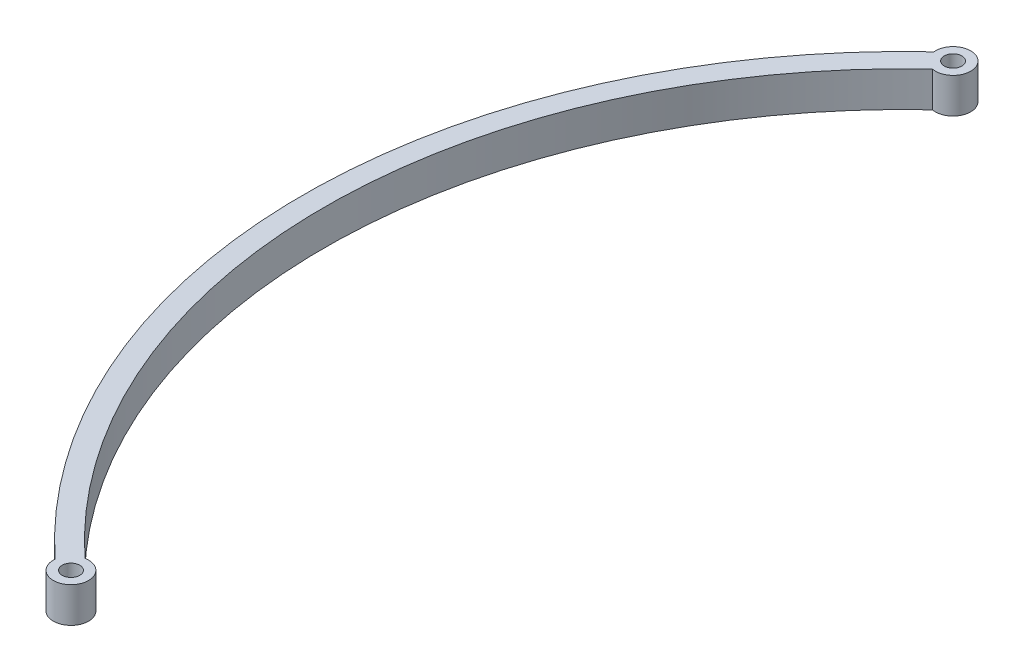
ISO-10303-21;
HEADER;
FILE_DESCRIPTION(('STEP AP214'),'2;1');
FILE_NAME('part.step','',(''),(''),'','','');
FILE_SCHEMA(('AUTOMOTIVE_DESIGN { 1 0 10303 214 1 1 1 1 }'));
ENDSEC;
DATA;
#1=APPLICATION_CONTEXT('core data for automotive mechanical design processes');
#2=APPLICATION_PROTOCOL_DEFINITION('international standard','automotive_design',2000,#1);
#3=PRODUCT_CONTEXT('',#1,'mechanical');
#4=PRODUCT('Part','Part','',(#3));
#5=PRODUCT_RELATED_PRODUCT_CATEGORY('part','',(#4));
#6=PRODUCT_DEFINITION_FORMATION('','',#4);
#7=PRODUCT_DEFINITION_CONTEXT('part definition',#1,'design');
#8=PRODUCT_DEFINITION('design','',#6,#7);
#9=PRODUCT_DEFINITION_SHAPE('','',#8);
#10=(LENGTH_UNIT() NAMED_UNIT(*) SI_UNIT(.MILLI.,.METRE.));
#11=(NAMED_UNIT(*) PLANE_ANGLE_UNIT() SI_UNIT($,.RADIAN.));
#12=(NAMED_UNIT(*) SI_UNIT($,.STERADIAN.) SOLID_ANGLE_UNIT());
#13=UNCERTAINTY_MEASURE_WITH_UNIT(LENGTH_MEASURE(1.E-05),#10,'distance_accuracy_value','');
#14=(GEOMETRIC_REPRESENTATION_CONTEXT(3) GLOBAL_UNCERTAINTY_ASSIGNED_CONTEXT((#13)) GLOBAL_UNIT_ASSIGNED_CONTEXT((#10,
#11,#12)) REPRESENTATION_CONTEXT('',''));
#15=CARTESIAN_POINT('',(0.,0.,0.));
#16=DIRECTION('',(0.,0.,1.));
#17=DIRECTION('',(1.,0.,0.));
#18=AXIS2_PLACEMENT_3D('',#15,#16,#17);
#19=CARTESIAN_POINT('',(110.830809160293,10.,-93.6090738604403));
#20=DIRECTION('',(0.,-1.,0.));
#21=DIRECTION('',(0.,0.,-1.));
#22=AXIS2_PLACEMENT_3D('',#19,#20,#21);
#23=CYLINDRICAL_SURFACE('',#22,170.058278032354);
#24=CARTESIAN_POINT('',(110.830809160293,0.,-93.6090738604403));
#25=DIRECTION('',(0.,1.,0.));
#26=DIRECTION('',(0.,0.,1.));
#27=AXIS2_PLACEMENT_3D('',#24,#25,#26);
#28=CIRCLE('',#27,170.058278032354);
#29=CARTESIAN_POINT('',(-4.97801718630081,0.,-218.140731151084));
#30=VERTEX_POINT('',#29);
#31=CARTESIAN_POINT('',(-4.97801718624232,0.,30.9225834302554));
#32=VERTEX_POINT('',#31);
#33=EDGE_CURVE('E95',#30,#32,#28,.T.);
#34=ORIENTED_EDGE('',*,*,#33,.T.);
#35=DIRECTION('',(0.,-1.,0.));
#36=VECTOR('',#35,1.);
#37=CARTESIAN_POINT('',(-4.97801718624232,10.,30.9225834302554));
#38=LINE('',#37,#36);
#39=CARTESIAN_POINT('',(-4.97801718624232,10.,30.9225834302554));
#40=VERTEX_POINT('',#39);
#41=EDGE_CURVE('E11',#40,#32,#38,.T.);
#42=ORIENTED_EDGE('',*,*,#41,.F.);
#43=CARTESIAN_POINT('',(110.830809160293,10.,-93.6090738604403));
#44=DIRECTION('',(0.,1.,0.));
#45=DIRECTION('',(0.,0.,1.));
#46=AXIS2_PLACEMENT_3D('',#43,#44,#45);
#47=CIRCLE('',#46,170.058278032354);
#48=CARTESIAN_POINT('',(-4.97801718630081,10.,-218.140731151084));
#49=VERTEX_POINT('',#48);
#50=EDGE_CURVE('E83',#49,#40,#47,.T.);
#51=ORIENTED_EDGE('',*,*,#50,.F.);
#52=DIRECTION('',(0.,-1.,0.));
#53=VECTOR('',#52,1.);
#54=CARTESIAN_POINT('',(-4.97801718630081,10.,-218.140731151084));
#55=LINE('',#54,#53);
#56=EDGE_CURVE('E91',#49,#30,#55,.T.);
#57=ORIENTED_EDGE('',*,*,#56,.T.);
#58=EDGE_LOOP('',(#34,#42,#51,#57));
#59=FACE_BOUND('',#58,.T.);
#60=ADVANCED_FACE('F32',(#59),#23,.T.);
#61=CARTESIAN_POINT('',(3.82679998800484E-12,10.,31.3909261396098));
#62=DIRECTION('',(0.,-1.,0.));
#63=DIRECTION('',(0.,0.,-1.));
#64=AXIS2_PLACEMENT_3D('',#61,#62,#63);
#65=CYLINDRICAL_SURFACE('',#64,4.99999999999675);
#66=CARTESIAN_POINT('',(3.82679998800484E-12,0.,31.3909261396098));
#67=DIRECTION('',(0.,1.,0.));
#68=DIRECTION('',(0.,0.,1.));
#69=AXIS2_PLACEMENT_3D('',#66,#67,#68);
#70=CIRCLE('',#69,4.99999999999675);
#71=CARTESIAN_POINT('',(-0.943707895465828,0.,26.4807921895021));
#72=VERTEX_POINT('',#71);
#73=EDGE_CURVE('E87',#32,#72,#70,.T.);
#74=ORIENTED_EDGE('',*,*,#73,.T.);
#75=DIRECTION('',(0.,-1.,0.));
#76=VECTOR('',#75,1.);
#77=CARTESIAN_POINT('',(-0.943707895465828,10.,26.4807921895021));
#78=LINE('',#77,#76);
#79=CARTESIAN_POINT('',(-0.943707895465828,10.,26.4807921895021));
#80=VERTEX_POINT('',#79);
#81=EDGE_CURVE('E40',#80,#72,#78,.T.);
#82=ORIENTED_EDGE('',*,*,#81,.F.);
#83=CARTESIAN_POINT('',(3.82679998800484E-12,10.,31.3909261396098));
#84=DIRECTION('',(0.,1.,0.));
#85=DIRECTION('',(0.,0.,1.));
#86=AXIS2_PLACEMENT_3D('',#83,#84,#85);
#87=CIRCLE('',#86,4.99999999999675);
#88=EDGE_CURVE('E78',#40,#80,#87,.T.);
#89=ORIENTED_EDGE('',*,*,#88,.F.);
#90=ORIENTED_EDGE('',*,*,#41,.T.);
#91=EDGE_LOOP('',(#74,#82,#89,#90));
#92=FACE_BOUND('',#91,.T.);
#93=ADVANCED_FACE('F86',(#92),#65,.T.);
#94=CARTESIAN_POINT('',(110.830809160322,10.,-93.6090738604163));
#95=DIRECTION('',(0.,-1.,0.));
#96=DIRECTION('',(0.,0.,-1.));
#97=AXIS2_PLACEMENT_3D('',#94,#95,#96);
#98=CYLINDRICAL_SURFACE('',#97,164.058278032357);
#99=CARTESIAN_POINT('',(110.830809160322,0.,-93.6090738604163));
#100=DIRECTION('',(0.,-1.,0.));
#101=DIRECTION('',(0.,0.,1.));
#102=AXIS2_PLACEMENT_3D('',#99,#100,#101);
#103=CIRCLE('',#102,164.058278032357);
#104=CARTESIAN_POINT('',(-0.943707895522329,0.,-213.698939910281));
#105=VERTEX_POINT('',#104);
#106=EDGE_CURVE('E65',#72,#105,#103,.T.);
#107=ORIENTED_EDGE('',*,*,#106,.T.);
#108=DIRECTION('',(0.,-1.,0.));
#109=VECTOR('',#108,1.);
#110=CARTESIAN_POINT('',(-0.943707895522329,10.,-213.698939910281));
#111=LINE('',#110,#109);
#112=CARTESIAN_POINT('',(-0.943707895522329,10.,-213.698939910281));
#113=VERTEX_POINT('',#112);
#114=EDGE_CURVE('E88',#113,#105,#111,.T.);
#115=ORIENTED_EDGE('',*,*,#114,.F.);
#116=CARTESIAN_POINT('',(110.830809160322,10.,-93.6090738604163));
#117=DIRECTION('',(0.,-1.,0.));
#118=DIRECTION('',(0.,0.,1.));
#119=AXIS2_PLACEMENT_3D('',#116,#117,#118);
#120=CIRCLE('',#119,164.058278032357);
#121=EDGE_CURVE('E81',#80,#113,#120,.T.);
#122=ORIENTED_EDGE('',*,*,#121,.F.);
#123=ORIENTED_EDGE('',*,*,#81,.T.);
#124=EDGE_LOOP('',(#107,#115,#122,#123));
#125=FACE_BOUND('',#124,.T.);
#126=ADVANCED_FACE('F89',(#125),#98,.F.);
#127=CARTESIAN_POINT('',(-4.68453401070157E-11,10.,-218.60907386039));
#128=DIRECTION('',(0.,-1.,0.));
#129=DIRECTION('',(0.,0.,-1.));
#130=AXIS2_PLACEMENT_3D('',#127,#128,#129);
#131=CYLINDRICAL_SURFACE('',#130,5.);
#132=CARTESIAN_POINT('',(-4.68453401070157E-11,0.,-218.60907386039));
#133=DIRECTION('',(0.,1.,0.));
#134=DIRECTION('',(0.,0.,1.));
#135=AXIS2_PLACEMENT_3D('',#132,#133,#134);
#136=CIRCLE('',#135,5.);
#137=EDGE_CURVE('E71',#105,#30,#136,.T.);
#138=ORIENTED_EDGE('',*,*,#137,.T.);
#139=ORIENTED_EDGE('',*,*,#56,.F.);
#140=CARTESIAN_POINT('',(-4.68453401070157E-11,10.,-218.60907386039));
#141=DIRECTION('',(0.,1.,0.));
#142=DIRECTION('',(0.,0.,1.));
#143=AXIS2_PLACEMENT_3D('',#140,#141,#142);
#144=CIRCLE('',#143,5.);
#145=EDGE_CURVE('E48',#113,#49,#144,.T.);
#146=ORIENTED_EDGE('',*,*,#145,.F.);
#147=ORIENTED_EDGE('',*,*,#114,.T.);
#148=EDGE_LOOP('',(#138,#139,#146,#147));
#149=FACE_BOUND('',#148,.T.);
#150=ADVANCED_FACE('F103',(#149),#131,.T.);
#151=CARTESIAN_POINT('',(55.4154045801483,10.,-31.1090738604152));
#152=DIRECTION('',(0.,1.,0.));
#153=DIRECTION('',(0.,0.,1.));
#154=AXIS2_PLACEMENT_3D('',#151,#152,#153);
#155=PLANE('',#154);
#156=CARTESIAN_POINT('',(3.82679998800484E-12,10.,31.3909261396098));
#157=DIRECTION('',(0.,1.,0.));
#158=DIRECTION('',(0.,0.,1.));
#159=AXIS2_PLACEMENT_3D('',#156,#157,#158);
#160=CIRCLE('',#159,2.5);
#161=CARTESIAN_POINT('',(3.82679998800484E-12,10.,33.8909261396098));
#162=VERTEX_POINT('',#161);
#163=EDGE_CURVE('E115',#162,#162,#160,.T.);
#164=ORIENTED_EDGE('',*,*,#163,.F.);
#165=EDGE_LOOP('',(#164));
#166=FACE_BOUND('',#165,.T.);
#167=CARTESIAN_POINT('',(-4.68453401070157E-11,10.,-218.60907386039));
#168=DIRECTION('',(0.,1.,0.));
#169=DIRECTION('',(0.,0.,1.));
#170=AXIS2_PLACEMENT_3D('',#167,#168,#169);
#171=CIRCLE('',#170,2.5);
#172=CARTESIAN_POINT('',(-4.68453401070157E-11,10.,-216.10907386039));
#173=VERTEX_POINT('',#172);
#174=EDGE_CURVE('E109',#173,#173,#171,.T.);
#175=ORIENTED_EDGE('',*,*,#174,.F.);
#176=EDGE_LOOP('',(#175));
#177=FACE_BOUND('',#176,.T.);
#178=ORIENTED_EDGE('',*,*,#50,.T.);
#179=ORIENTED_EDGE('',*,*,#88,.T.);
#180=ORIENTED_EDGE('',*,*,#121,.T.);
#181=ORIENTED_EDGE('',*,*,#145,.T.);
#182=EDGE_LOOP('',(#178,#179,#180,#181));
#183=FACE_BOUND('',#182,.T.);
#184=ADVANCED_FACE('F79',(#166,#177,#183),#155,.T.);
#185=CARTESIAN_POINT('',(55.4154045801483,0.,-31.1090738604152));
#186=DIRECTION('',(0.,1.,0.));
#187=DIRECTION('',(0.,0.,1.));
#188=AXIS2_PLACEMENT_3D('',#185,#186,#187);
#189=PLANE('',#188);
#190=CARTESIAN_POINT('',(3.82679998800484E-12,0.,31.3909261396098));
#191=DIRECTION('',(0.,1.,0.));
#192=DIRECTION('',(0.,0.,1.));
#193=AXIS2_PLACEMENT_3D('',#190,#191,#192);
#194=CIRCLE('',#193,2.5);
#195=CARTESIAN_POINT('',(3.82679998800484E-12,0.,33.8909261396098));
#196=VERTEX_POINT('',#195);
#197=EDGE_CURVE('E112',#196,#196,#194,.T.);
#198=ORIENTED_EDGE('',*,*,#197,.T.);
#199=EDGE_LOOP('',(#198));
#200=FACE_BOUND('',#199,.T.);
#201=CARTESIAN_POINT('',(-4.68453401070157E-11,0.,-218.60907386039));
#202=DIRECTION('',(0.,1.,0.));
#203=DIRECTION('',(0.,0.,1.));
#204=AXIS2_PLACEMENT_3D('',#201,#202,#203);
#205=CIRCLE('',#204,2.5);
#206=CARTESIAN_POINT('',(-4.68453401070157E-11,0.,-216.10907386039));
#207=VERTEX_POINT('',#206);
#208=EDGE_CURVE('E98',#207,#207,#205,.T.);
#209=ORIENTED_EDGE('',*,*,#208,.T.);
#210=EDGE_LOOP('',(#209));
#211=FACE_BOUND('',#210,.T.);
#212=ORIENTED_EDGE('',*,*,#33,.F.);
#213=ORIENTED_EDGE('',*,*,#137,.F.);
#214=ORIENTED_EDGE('',*,*,#106,.F.);
#215=ORIENTED_EDGE('',*,*,#73,.F.);
#216=EDGE_LOOP('',(#212,#213,#214,#215));
#217=FACE_BOUND('',#216,.T.);
#218=ADVANCED_FACE('F106',(#200,#211,#217),#189,.F.);
#219=CARTESIAN_POINT('',(-4.68453401070157E-11,0.,-218.60907386039));
#220=DIRECTION('',(0.,1.,0.));
#221=DIRECTION('',(0.,0.,1.));
#222=AXIS2_PLACEMENT_3D('',#219,#220,#221);
#223=CYLINDRICAL_SURFACE('',#222,2.5);
#224=ORIENTED_EDGE('',*,*,#208,.F.);
#225=EDGE_LOOP('',(#224));
#226=FACE_BOUND('',#225,.T.);
#227=ORIENTED_EDGE('',*,*,#174,.T.);
#228=EDGE_LOOP('',(#227));
#229=FACE_BOUND('',#228,.T.);
#230=ADVANCED_FACE('F126',(#226,#229),#223,.F.);
#231=CARTESIAN_POINT('',(3.82679998800484E-12,0.,31.3909261396098));
#232=DIRECTION('',(0.,1.,0.));
#233=DIRECTION('',(0.,0.,1.));
#234=AXIS2_PLACEMENT_3D('',#231,#232,#233);
#235=CYLINDRICAL_SURFACE('',#234,2.5);
#236=ORIENTED_EDGE('',*,*,#197,.F.);
#237=EDGE_LOOP('',(#236));
#238=FACE_BOUND('',#237,.T.);
#239=ORIENTED_EDGE('',*,*,#163,.T.);
#240=EDGE_LOOP('',(#239));
#241=FACE_BOUND('',#240,.T.);
#242=ADVANCED_FACE('F123',(#238,#241),#235,.F.);
#243=CLOSED_SHELL('',(#60,#93,#126,#150,#184,#218,#230,#242));
#244=MANIFOLD_SOLID_BREP('B2',#243);
#245=ADVANCED_BREP_SHAPE_REPRESENTATION('',(#18,#244),#14);
#246=SHAPE_DEFINITION_REPRESENTATION(#9,#245);
ENDSEC;
END-ISO-10303-21;
